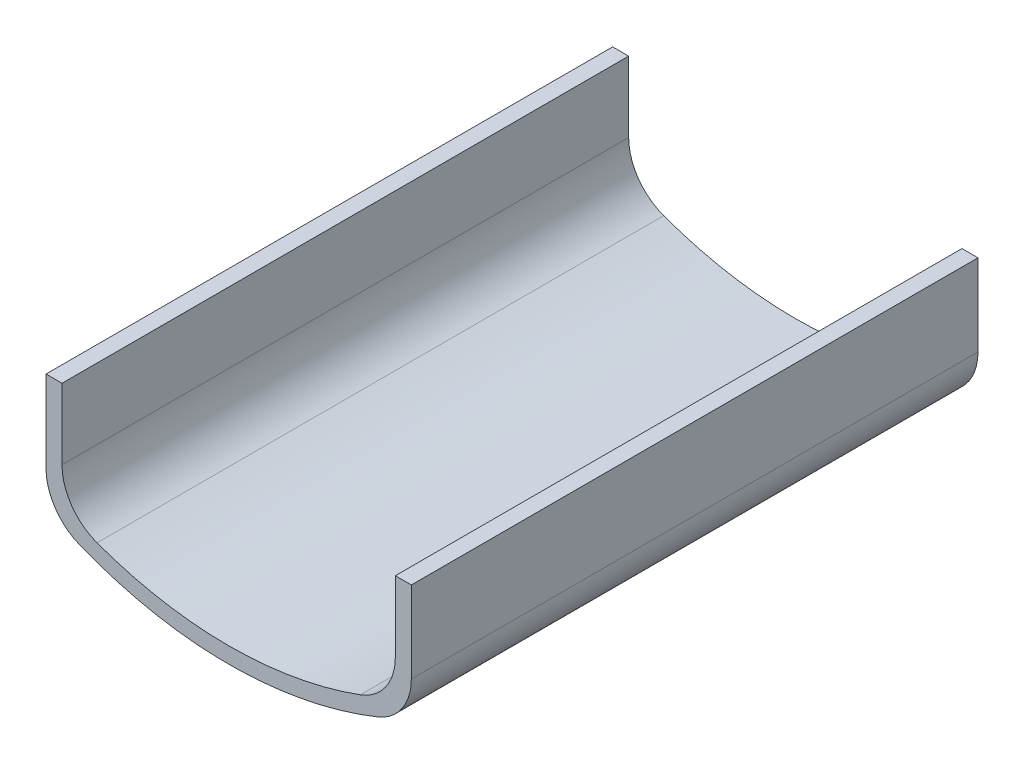
ISO-10303-21;
HEADER;
FILE_DESCRIPTION(('STEP AP214'),'2;1');
FILE_NAME('part.step','',(''),(''),'','','');
FILE_SCHEMA(('AUTOMOTIVE_DESIGN { 1 0 10303 214 1 1 1 1 }'));
ENDSEC;
DATA;
#1=APPLICATION_CONTEXT('core data for automotive mechanical design processes');
#2=APPLICATION_PROTOCOL_DEFINITION('international standard','automotive_design',2000,#1);
#3=PRODUCT_CONTEXT('',#1,'mechanical');
#4=PRODUCT('Part','Part','',(#3));
#5=PRODUCT_RELATED_PRODUCT_CATEGORY('part','',(#4));
#6=PRODUCT_DEFINITION_FORMATION('','',#4);
#7=PRODUCT_DEFINITION_CONTEXT('part definition',#1,'design');
#8=PRODUCT_DEFINITION('design','',#6,#7);
#9=PRODUCT_DEFINITION_SHAPE('','',#8);
#10=(LENGTH_UNIT() NAMED_UNIT(*) SI_UNIT(.MILLI.,.METRE.));
#11=(NAMED_UNIT(*) PLANE_ANGLE_UNIT() SI_UNIT($,.RADIAN.));
#12=(NAMED_UNIT(*) SI_UNIT($,.STERADIAN.) SOLID_ANGLE_UNIT());
#13=UNCERTAINTY_MEASURE_WITH_UNIT(LENGTH_MEASURE(1.E-05),#10,'distance_accuracy_value','');
#14=(GEOMETRIC_REPRESENTATION_CONTEXT(3) GLOBAL_UNCERTAINTY_ASSIGNED_CONTEXT((#13)) GLOBAL_UNIT_ASSIGNED_CONTEXT((#10,
#11,#12)) REPRESENTATION_CONTEXT('',''));
#15=CARTESIAN_POINT('',(0.,0.,0.));
#16=DIRECTION('',(0.,0.,1.));
#17=DIRECTION('',(1.,0.,0.));
#18=AXIS2_PLACEMENT_3D('',#15,#16,#17);
#19=CARTESIAN_POINT('',(6.1595,1.1566413798937,26.9875));
#20=DIRECTION('',(0.,0.,-1.));
#21=DIRECTION('',(-1.,0.,0.));
#22=AXIS2_PLACEMENT_3D('',#19,#20,#21);
#23=CYLINDRICAL_SURFACE('',#22,2.54);
#24=CARTESIAN_POINT('',(6.1595,1.1566413798937,0.));
#25=DIRECTION('',(0.,0.,1.));
#26=DIRECTION('',(1.,0.,0.));
#27=AXIS2_PLACEMENT_3D('',#24,#25,#26);
#28=CIRCLE('',#27,2.54);
#29=CARTESIAN_POINT('',(7.10894123314065,-1.1992366612647,0.));
#30=VERTEX_POINT('',#29);
#31=CARTESIAN_POINT('',(8.6995,1.1566413798937,0.));
#32=VERTEX_POINT('',#31);
#33=EDGE_CURVE('E170',#30,#32,#28,.T.);
#34=ORIENTED_EDGE('',*,*,#33,.T.);
#35=DIRECTION('',(0.,0.,-1.));
#36=VECTOR('',#35,1.);
#37=CARTESIAN_POINT('',(8.6995,1.1566413798937,26.9875));
#38=LINE('',#37,#36);
#39=CARTESIAN_POINT('',(8.6995,1.1566413798937,26.9875));
#40=VERTEX_POINT('',#39);
#41=EDGE_CURVE('E11',#40,#32,#38,.T.);
#42=ORIENTED_EDGE('',*,*,#41,.F.);
#43=CARTESIAN_POINT('',(6.1595,1.1566413798937,26.9875));
#44=DIRECTION('',(0.,0.,1.));
#45=DIRECTION('',(1.,0.,0.));
#46=AXIS2_PLACEMENT_3D('',#43,#44,#45);
#47=CIRCLE('',#46,2.54);
#48=CARTESIAN_POINT('',(7.10894123314065,-1.1992366612647,26.9875));
#49=VERTEX_POINT('',#48);
#50=EDGE_CURVE('E111',#49,#40,#47,.T.);
#51=ORIENTED_EDGE('',*,*,#50,.F.);
#52=DIRECTION('',(0.,0.,-1.));
#53=VECTOR('',#52,1.);
#54=CARTESIAN_POINT('',(7.10894123314065,-1.1992366612647,26.9875));
#55=LINE('',#54,#53);
#56=EDGE_CURVE('E62',#49,#30,#55,.T.);
#57=ORIENTED_EDGE('',*,*,#56,.T.);
#58=EDGE_LOOP('',(#34,#42,#51,#57));
#59=FACE_BOUND('',#58,.T.);
#60=ADVANCED_FACE('F45',(#59),#23,.T.);
#61=CARTESIAN_POINT('',(8.6995,5.04103367018493,26.9875));
#62=DIRECTION('',(1.,0.,0.));
#63=DIRECTION('',(0.,1.,0.));
#64=AXIS2_PLACEMENT_3D('',#61,#62,#63);
#65=PLANE('',#64);
#66=DIRECTION('',(0.,-1.,0.));
#67=VECTOR('',#66,1.);
#68=CARTESIAN_POINT('',(8.6995,5.04103367018493,0.));
#69=LINE('',#68,#67);
#70=CARTESIAN_POINT('',(8.6995,5.04103367018493,0.));
#71=VERTEX_POINT('',#70);
#72=EDGE_CURVE('E173',#71,#32,#69,.T.);
#73=ORIENTED_EDGE('',*,*,#72,.F.);
#74=DIRECTION('',(0.,0.,-1.));
#75=VECTOR('',#74,1.);
#76=CARTESIAN_POINT('',(8.6995,5.04103367018493,26.9875));
#77=LINE('',#76,#75);
#78=CARTESIAN_POINT('',(8.6995,5.04103367018493,26.9875));
#79=VERTEX_POINT('',#78);
#80=EDGE_CURVE('E54',#79,#71,#77,.T.);
#81=ORIENTED_EDGE('',*,*,#80,.F.);
#82=DIRECTION('',(0.,-1.,0.));
#83=VECTOR('',#82,1.);
#84=CARTESIAN_POINT('',(8.6995,5.04103367018493,26.9875));
#85=LINE('',#84,#83);
#86=EDGE_CURVE('E404',#79,#40,#85,.T.);
#87=ORIENTED_EDGE('',*,*,#86,.T.);
#88=ORIENTED_EDGE('',*,*,#41,.T.);
#89=EDGE_LOOP('',(#73,#81,#87,#88));
#90=FACE_BOUND('',#89,.T.);
#91=ADVANCED_FACE('F246',(#90),#65,.T.);
#92=CARTESIAN_POINT('',(7.9375,5.04103367018493,26.9875));
#93=DIRECTION('',(0.,1.,0.));
#94=DIRECTION('',(-1.,0.,0.));
#95=AXIS2_PLACEMENT_3D('',#92,#93,#94);
#96=PLANE('',#95);
#97=DIRECTION('',(1.,0.,0.));
#98=VECTOR('',#97,1.);
#99=CARTESIAN_POINT('',(7.9375,5.04103367018493,0.));
#100=LINE('',#99,#98);
#101=CARTESIAN_POINT('',(7.9375,5.04103367018493,0.));
#102=VERTEX_POINT('',#101);
#103=EDGE_CURVE('E177',#102,#71,#100,.T.);
#104=ORIENTED_EDGE('',*,*,#103,.F.);
#105=DIRECTION('',(0.,0.,-1.));
#106=VECTOR('',#105,1.);
#107=CARTESIAN_POINT('',(7.9375,5.04103367018493,26.9875));
#108=LINE('',#107,#106);
#109=CARTESIAN_POINT('',(7.9375,5.04103367018493,26.9875));
#110=VERTEX_POINT('',#109);
#111=EDGE_CURVE('E234',#110,#102,#108,.T.);
#112=ORIENTED_EDGE('',*,*,#111,.F.);
#113=DIRECTION('',(1.,0.,0.));
#114=VECTOR('',#113,1.);
#115=CARTESIAN_POINT('',(7.9375,5.04103367018493,26.9875));
#116=LINE('',#115,#114);
#117=EDGE_CURVE('E243',#110,#79,#116,.T.);
#118=ORIENTED_EDGE('',*,*,#117,.T.);
#119=ORIENTED_EDGE('',*,*,#80,.T.);
#120=EDGE_LOOP('',(#104,#112,#118,#119));
#121=FACE_BOUND('',#120,.T.);
#122=ADVANCED_FACE('F241',(#121),#96,.T.);
#123=CARTESIAN_POINT('',(7.9375,5.04103367018493,26.9875));
#124=DIRECTION('',(1.,0.,0.));
#125=DIRECTION('',(0.,0.,-1.));
#126=AXIS2_PLACEMENT_3D('',#123,#124,#125);
#127=PLANE('',#126);
#128=DIRECTION('',(0.,-1.,0.));
#129=VECTOR('',#128,1.);
#130=CARTESIAN_POINT('',(7.9375,5.04103367018493,0.));
#131=LINE('',#130,#129);
#132=CARTESIAN_POINT('',(7.9375,1.68006454521999,0.));
#133=VERTEX_POINT('',#132);
#134=EDGE_CURVE('E181',#102,#133,#131,.T.);
#135=ORIENTED_EDGE('',*,*,#134,.T.);
#136=DIRECTION('',(0.,0.,-1.));
#137=VECTOR('',#136,1.);
#138=CARTESIAN_POINT('',(7.9375,1.68006454521999,26.9875));
#139=LINE('',#138,#137);
#140=CARTESIAN_POINT('',(7.9375,1.68006454521999,26.9875));
#141=VERTEX_POINT('',#140);
#142=EDGE_CURVE('E230',#141,#133,#139,.T.);
#143=ORIENTED_EDGE('',*,*,#142,.F.);
#144=DIRECTION('',(0.,-1.,0.));
#145=VECTOR('',#144,1.);
#146=CARTESIAN_POINT('',(7.9375,5.04103367018493,26.9875));
#147=LINE('',#146,#145);
#148=EDGE_CURVE('E264',#110,#141,#147,.T.);
#149=ORIENTED_EDGE('',*,*,#148,.F.);
#150=ORIENTED_EDGE('',*,*,#111,.T.);
#151=EDGE_LOOP('',(#135,#143,#149,#150));
#152=FACE_BOUND('',#151,.T.);
#153=ADVANCED_FACE('F254',(#152),#127,.F.);
#154=CARTESIAN_POINT('',(5.3975,1.68006454521999,26.9875));
#155=DIRECTION('',(0.,0.,-1.));
#156=DIRECTION('',(-1.,0.,0.));
#157=AXIS2_PLACEMENT_3D('',#154,#155,#156);
#158=CYLINDRICAL_SURFACE('',#157,2.54);
#159=CARTESIAN_POINT('',(5.3975,1.68006454521999,0.));
#160=DIRECTION('',(0.,0.,-1.));
#161=DIRECTION('',(-1.,0.,0.));
#162=AXIS2_PLACEMENT_3D('',#159,#160,#161);
#163=CIRCLE('',#162,2.54);
#164=CARTESIAN_POINT('',(6.26982323232323,-0.705444242931747,0.));
#165=VERTEX_POINT('',#164);
#166=EDGE_CURVE('E184',#133,#165,#163,.T.);
#167=ORIENTED_EDGE('',*,*,#166,.T.);
#168=DIRECTION('',(0.,0.,-1.));
#169=VECTOR('',#168,1.);
#170=CARTESIAN_POINT('',(6.26982323232323,-0.705444242931747,26.9875));
#171=LINE('',#170,#169);
#172=CARTESIAN_POINT('',(6.26982323232323,-0.705444242931747,26.9875));
#173=VERTEX_POINT('',#172);
#174=EDGE_CURVE('E226',#173,#165,#171,.T.);
#175=ORIENTED_EDGE('',*,*,#174,.F.);
#176=CARTESIAN_POINT('',(5.3975,1.68006454521999,26.9875));
#177=DIRECTION('',(0.,0.,-1.));
#178=DIRECTION('',(-1.,0.,0.));
#179=AXIS2_PLACEMENT_3D('',#176,#177,#178);
#180=CIRCLE('',#179,2.54);
#181=EDGE_CURVE('E260',#141,#173,#180,.T.);
#182=ORIENTED_EDGE('',*,*,#181,.F.);
#183=ORIENTED_EDGE('',*,*,#142,.T.);
#184=EDGE_LOOP('',(#167,#175,#182,#183));
#185=FACE_BOUND('',#184,.T.);
#186=ADVANCED_FACE('F258',(#185),#158,.F.);
#187=CARTESIAN_POINT('',(0.,16.4404001719088,26.9875));
#188=DIRECTION('',(0.,0.,-1.));
#189=DIRECTION('',(-1.,0.,0.));
#190=AXIS2_PLACEMENT_3D('',#187,#188,#189);
#191=CYLINDRICAL_SURFACE('',#190,18.25625);
#192=CARTESIAN_POINT('',(0.,16.4404001719088,0.));
#193=DIRECTION('',(0.,0.,-1.));
#194=DIRECTION('',(-1.,0.,0.));
#195=AXIS2_PLACEMENT_3D('',#192,#193,#194);
#196=CIRCLE('',#195,18.25625);
#197=CARTESIAN_POINT('',(-6.26982323232323,-0.705444242931744,0.));
#198=VERTEX_POINT('',#197);
#199=EDGE_CURVE('E187',#165,#198,#196,.T.);
#200=ORIENTED_EDGE('',*,*,#199,.T.);
#201=DIRECTION('',(0.,0.,-1.));
#202=VECTOR('',#201,1.);
#203=CARTESIAN_POINT('',(-6.26982323232323,-0.705444242931744,26.9875));
#204=LINE('',#203,#202);
#205=CARTESIAN_POINT('',(-6.26982323232323,-0.705444242931744,26.9875));
#206=VERTEX_POINT('',#205);
#207=EDGE_CURVE('E223',#206,#198,#204,.T.);
#208=ORIENTED_EDGE('',*,*,#207,.F.);
#209=CARTESIAN_POINT('',(0.,16.4404001719088,26.9875));
#210=DIRECTION('',(0.,0.,-1.));
#211=DIRECTION('',(-1.,0.,0.));
#212=AXIS2_PLACEMENT_3D('',#209,#210,#211);
#213=CIRCLE('',#212,18.25625);
#214=EDGE_CURVE('E263',#173,#206,#213,.T.);
#215=ORIENTED_EDGE('',*,*,#214,.F.);
#216=ORIENTED_EDGE('',*,*,#174,.T.);
#217=EDGE_LOOP('',(#200,#208,#215,#216));
#218=FACE_BOUND('',#217,.T.);
#219=ADVANCED_FACE('F357',(#218),#191,.F.);
#220=CARTESIAN_POINT('',(-5.3975,1.68006454521999,26.9875));
#221=DIRECTION('',(0.,0.,-1.));
#222=DIRECTION('',(-1.,0.,0.));
#223=AXIS2_PLACEMENT_3D('',#220,#221,#222);
#224=CYLINDRICAL_SURFACE('',#223,2.54);
#225=CARTESIAN_POINT('',(-5.3975,1.68006454521999,0.));
#226=DIRECTION('',(0.,0.,1.));
#227=DIRECTION('',(1.,0.,0.));
#228=AXIS2_PLACEMENT_3D('',#225,#226,#227);
#229=CIRCLE('',#228,2.54);
#230=CARTESIAN_POINT('',(-7.9375,1.68006454521999,0.));
#231=VERTEX_POINT('',#230);
#232=EDGE_CURVE('E191',#231,#198,#229,.T.);
#233=ORIENTED_EDGE('',*,*,#232,.F.);
#234=DIRECTION('',(0.,0.,-1.));
#235=VECTOR('',#234,1.);
#236=CARTESIAN_POINT('',(-7.9375,1.68006454521999,26.9875));
#237=LINE('',#236,#235);
#238=CARTESIAN_POINT('',(-7.9375,1.68006454521999,26.9875));
#239=VERTEX_POINT('',#238);
#240=EDGE_CURVE('E220',#239,#231,#237,.T.);
#241=ORIENTED_EDGE('',*,*,#240,.F.);
#242=CARTESIAN_POINT('',(-5.3975,1.68006454521999,26.9875));
#243=DIRECTION('',(0.,0.,1.));
#244=DIRECTION('',(1.,0.,0.));
#245=AXIS2_PLACEMENT_3D('',#242,#243,#244);
#246=CIRCLE('',#245,2.54);
#247=EDGE_CURVE('E268',#239,#206,#246,.T.);
#248=ORIENTED_EDGE('',*,*,#247,.T.);
#249=ORIENTED_EDGE('',*,*,#207,.T.);
#250=EDGE_LOOP('',(#233,#241,#248,#249));
#251=FACE_BOUND('',#250,.T.);
#252=ADVANCED_FACE('F287',(#251),#224,.F.);
#253=CARTESIAN_POINT('',(-7.9375,5.04103367018493,26.9875));
#254=DIRECTION('',(1.,0.,0.));
#255=DIRECTION('',(0.,0.,-1.));
#256=AXIS2_PLACEMENT_3D('',#253,#254,#255);
#257=PLANE('',#256);
#258=DIRECTION('',(0.,-1.,0.));
#259=VECTOR('',#258,1.);
#260=CARTESIAN_POINT('',(-7.9375,5.04103367018493,0.));
#261=LINE('',#260,#259);
#262=CARTESIAN_POINT('',(-7.9375,5.04103367018493,0.));
#263=VERTEX_POINT('',#262);
#264=EDGE_CURVE('E195',#263,#231,#261,.T.);
#265=ORIENTED_EDGE('',*,*,#264,.F.);
#266=DIRECTION('',(0.,0.,-1.));
#267=VECTOR('',#266,1.);
#268=CARTESIAN_POINT('',(-7.9375,5.04103367018493,26.9875));
#269=LINE('',#268,#267);
#270=CARTESIAN_POINT('',(-7.9375,5.04103367018493,26.9875));
#271=VERTEX_POINT('',#270);
#272=EDGE_CURVE('E217',#271,#263,#269,.T.);
#273=ORIENTED_EDGE('',*,*,#272,.F.);
#274=DIRECTION('',(0.,-1.,0.));
#275=VECTOR('',#274,1.);
#276=CARTESIAN_POINT('',(-7.9375,5.04103367018493,26.9875));
#277=LINE('',#276,#275);
#278=EDGE_CURVE('E276',#271,#239,#277,.T.);
#279=ORIENTED_EDGE('',*,*,#278,.T.);
#280=ORIENTED_EDGE('',*,*,#240,.T.);
#281=EDGE_LOOP('',(#265,#273,#279,#280));
#282=FACE_BOUND('',#281,.T.);
#283=ADVANCED_FACE('F282',(#282),#257,.T.);
#284=CARTESIAN_POINT('',(-7.9375,5.04103367018493,26.9875));
#285=DIRECTION('',(0.,-1.,0.));
#286=DIRECTION('',(1.,0.,0.));
#287=AXIS2_PLACEMENT_3D('',#284,#285,#286);
#288=PLANE('',#287);
#289=DIRECTION('',(-1.,0.,0.));
#290=VECTOR('',#289,1.);
#291=CARTESIAN_POINT('',(-7.9375,5.04103367018493,0.));
#292=LINE('',#291,#290);
#293=CARTESIAN_POINT('',(-8.6995,5.04103367018492,0.));
#294=VERTEX_POINT('',#293);
#295=EDGE_CURVE('E199',#263,#294,#292,.T.);
#296=ORIENTED_EDGE('',*,*,#295,.T.);
#297=DIRECTION('',(0.,0.,-1.));
#298=VECTOR('',#297,1.);
#299=CARTESIAN_POINT('',(-8.6995,5.04103367018492,26.9875));
#300=LINE('',#299,#298);
#301=CARTESIAN_POINT('',(-8.6995,5.04103367018492,26.9875));
#302=VERTEX_POINT('',#301);
#303=EDGE_CURVE('E160',#302,#294,#300,.T.);
#304=ORIENTED_EDGE('',*,*,#303,.F.);
#305=DIRECTION('',(-1.,0.,0.));
#306=VECTOR('',#305,1.);
#307=CARTESIAN_POINT('',(-7.9375,5.04103367018493,26.9875));
#308=LINE('',#307,#306);
#309=EDGE_CURVE('E146',#271,#302,#308,.T.);
#310=ORIENTED_EDGE('',*,*,#309,.F.);
#311=ORIENTED_EDGE('',*,*,#272,.T.);
#312=EDGE_LOOP('',(#296,#304,#310,#311));
#313=FACE_BOUND('',#312,.T.);
#314=ADVANCED_FACE('F290',(#313),#288,.F.);
#315=CARTESIAN_POINT('',(-8.6995,5.04103367018492,26.9875));
#316=DIRECTION('',(1.,0.,0.));
#317=DIRECTION('',(0.,1.,0.));
#318=AXIS2_PLACEMENT_3D('',#315,#316,#317);
#319=PLANE('',#318);
#320=DIRECTION('',(0.,-1.,0.));
#321=VECTOR('',#320,1.);
#322=CARTESIAN_POINT('',(-8.6995,5.04103367018492,0.));
#323=LINE('',#322,#321);
#324=CARTESIAN_POINT('',(-8.6995,1.1566413798937,0.));
#325=VERTEX_POINT('',#324);
#326=EDGE_CURVE('E156',#294,#325,#323,.T.);
#327=ORIENTED_EDGE('',*,*,#326,.T.);
#328=DIRECTION('',(0.,0.,-1.));
#329=VECTOR('',#328,1.);
#330=CARTESIAN_POINT('',(-8.6995,1.1566413798937,26.9875));
#331=LINE('',#330,#329);
#332=CARTESIAN_POINT('',(-8.6995,1.1566413798937,26.9875));
#333=VERTEX_POINT('',#332);
#334=EDGE_CURVE('E153',#333,#325,#331,.T.);
#335=ORIENTED_EDGE('',*,*,#334,.F.);
#336=DIRECTION('',(0.,-1.,0.));
#337=VECTOR('',#336,1.);
#338=CARTESIAN_POINT('',(-8.6995,5.04103367018492,26.9875));
#339=LINE('',#338,#337);
#340=EDGE_CURVE('E139',#302,#333,#339,.T.);
#341=ORIENTED_EDGE('',*,*,#340,.F.);
#342=ORIENTED_EDGE('',*,*,#303,.T.);
#343=EDGE_LOOP('',(#327,#335,#341,#342));
#344=FACE_BOUND('',#343,.T.);
#345=ADVANCED_FACE('F154',(#344),#319,.F.);
#346=CARTESIAN_POINT('',(-6.1595,1.1566413798937,26.9875));
#347=DIRECTION('',(0.,0.,-1.));
#348=DIRECTION('',(-1.,0.,0.));
#349=AXIS2_PLACEMENT_3D('',#346,#347,#348);
#350=CYLINDRICAL_SURFACE('',#349,2.54);
#351=CARTESIAN_POINT('',(-6.1595,1.1566413798937,0.));
#352=DIRECTION('',(0.,0.,-1.));
#353=DIRECTION('',(-1.,0.,0.));
#354=AXIS2_PLACEMENT_3D('',#351,#352,#353);
#355=CIRCLE('',#354,2.54);
#356=CARTESIAN_POINT('',(-7.10894123314065,-1.19923666126471,0.));
#357=VERTEX_POINT('',#356);
#358=EDGE_CURVE('E204',#357,#325,#355,.T.);
#359=ORIENTED_EDGE('',*,*,#358,.F.);
#360=DIRECTION('',(0.,0.,-1.));
#361=VECTOR('',#360,1.);
#362=CARTESIAN_POINT('',(-7.10894123314065,-1.19923666126471,26.9875));
#363=LINE('',#362,#361);
#364=CARTESIAN_POINT('',(-7.10894123314065,-1.19923666126471,26.9875));
#365=VERTEX_POINT('',#364);
#366=EDGE_CURVE('E99',#365,#357,#363,.T.);
#367=ORIENTED_EDGE('',*,*,#366,.F.);
#368=CARTESIAN_POINT('',(-6.1595,1.1566413798937,26.9875));
#369=DIRECTION('',(0.,0.,-1.));
#370=DIRECTION('',(-1.,0.,0.));
#371=AXIS2_PLACEMENT_3D('',#368,#369,#370);
#372=CIRCLE('',#371,2.54);
#373=EDGE_CURVE('E143',#365,#333,#372,.T.);
#374=ORIENTED_EDGE('',*,*,#373,.T.);
#375=ORIENTED_EDGE('',*,*,#334,.T.);
#376=EDGE_LOOP('',(#359,#367,#374,#375));
#377=FACE_BOUND('',#376,.T.);
#378=ADVANCED_FACE('F162',(#377),#350,.T.);
#379=CARTESIAN_POINT('',(0.,16.4404001719088,26.9875));
#380=DIRECTION('',(0.,0.,-1.));
#381=DIRECTION('',(-1.,0.,0.));
#382=AXIS2_PLACEMENT_3D('',#379,#380,#381);
#383=CYLINDRICAL_SURFACE('',#382,19.01825);
#384=CARTESIAN_POINT('',(0.,16.4404001719088,0.));
#385=DIRECTION('',(0.,0.,-1.));
#386=DIRECTION('',(-1.,0.,0.));
#387=AXIS2_PLACEMENT_3D('',#384,#385,#386);
#388=CIRCLE('',#387,19.01825);
#389=EDGE_CURVE('E207',#30,#357,#388,.T.);
#390=ORIENTED_EDGE('',*,*,#389,.F.);
#391=ORIENTED_EDGE('',*,*,#56,.F.);
#392=CARTESIAN_POINT('',(0.,16.4404001719088,26.9875));
#393=DIRECTION('',(0.,0.,-1.));
#394=DIRECTION('',(-1.,0.,0.));
#395=AXIS2_PLACEMENT_3D('',#392,#393,#394);
#396=CIRCLE('',#395,19.01825);
#397=EDGE_CURVE('E164',#49,#365,#396,.T.);
#398=ORIENTED_EDGE('',*,*,#397,.T.);
#399=ORIENTED_EDGE('',*,*,#366,.T.);
#400=EDGE_LOOP('',(#390,#391,#398,#399));
#401=FACE_BOUND('',#400,.T.);
#402=ADVANCED_FACE('F303',(#401),#383,.T.);
#403=CARTESIAN_POINT('',(6.1595,1.1566413798937,26.9875));
#404=DIRECTION('',(0.,0.,1.));
#405=DIRECTION('',(1.,0.,0.));
#406=AXIS2_PLACEMENT_3D('',#403,#404,#405);
#407=PLANE('',#406);
#408=ORIENTED_EDGE('',*,*,#50,.T.);
#409=ORIENTED_EDGE('',*,*,#86,.F.);
#410=ORIENTED_EDGE('',*,*,#117,.F.);
#411=ORIENTED_EDGE('',*,*,#148,.T.);
#412=ORIENTED_EDGE('',*,*,#181,.T.);
#413=ORIENTED_EDGE('',*,*,#214,.T.);
#414=ORIENTED_EDGE('',*,*,#247,.F.);
#415=ORIENTED_EDGE('',*,*,#278,.F.);
#416=ORIENTED_EDGE('',*,*,#309,.T.);
#417=ORIENTED_EDGE('',*,*,#340,.T.);
#418=ORIENTED_EDGE('',*,*,#373,.F.);
#419=ORIENTED_EDGE('',*,*,#397,.F.);
#420=EDGE_LOOP('',(#408,#409,#410,#411,#412,#413,#414,#415,#416,#417,#418,#419));
#421=FACE_BOUND('',#420,.T.);
#422=ADVANCED_FACE('F141',(#421),#407,.T.);
#423=CARTESIAN_POINT('',(6.1595,1.1566413798937,0.));
#424=DIRECTION('',(0.,0.,1.));
#425=DIRECTION('',(1.,0.,0.));
#426=AXIS2_PLACEMENT_3D('',#423,#424,#425);
#427=PLANE('',#426);
#428=ORIENTED_EDGE('',*,*,#33,.F.);
#429=ORIENTED_EDGE('',*,*,#389,.T.);
#430=ORIENTED_EDGE('',*,*,#358,.T.);
#431=ORIENTED_EDGE('',*,*,#326,.F.);
#432=ORIENTED_EDGE('',*,*,#295,.F.);
#433=ORIENTED_EDGE('',*,*,#264,.T.);
#434=ORIENTED_EDGE('',*,*,#232,.T.);
#435=ORIENTED_EDGE('',*,*,#199,.F.);
#436=ORIENTED_EDGE('',*,*,#166,.F.);
#437=ORIENTED_EDGE('',*,*,#134,.F.);
#438=ORIENTED_EDGE('',*,*,#103,.T.);
#439=ORIENTED_EDGE('',*,*,#72,.T.);
#440=EDGE_LOOP('',(#428,#429,#430,#431,#432,#433,#434,#435,#436,#437,#438,#439));
#441=FACE_BOUND('',#440,.T.);
#442=ADVANCED_FACE('F249',(#441),#427,.F.);
#443=CLOSED_SHELL('',(#60,#91,#122,#153,#186,#219,#252,#283,#314,#345,#378,#402,#422,#442));
#444=MANIFOLD_SOLID_BREP('B2',#443);
#445=ADVANCED_BREP_SHAPE_REPRESENTATION('',(#18,#444),#14);
#446=SHAPE_DEFINITION_REPRESENTATION(#9,#445);
ENDSEC;
END-ISO-10303-21;
